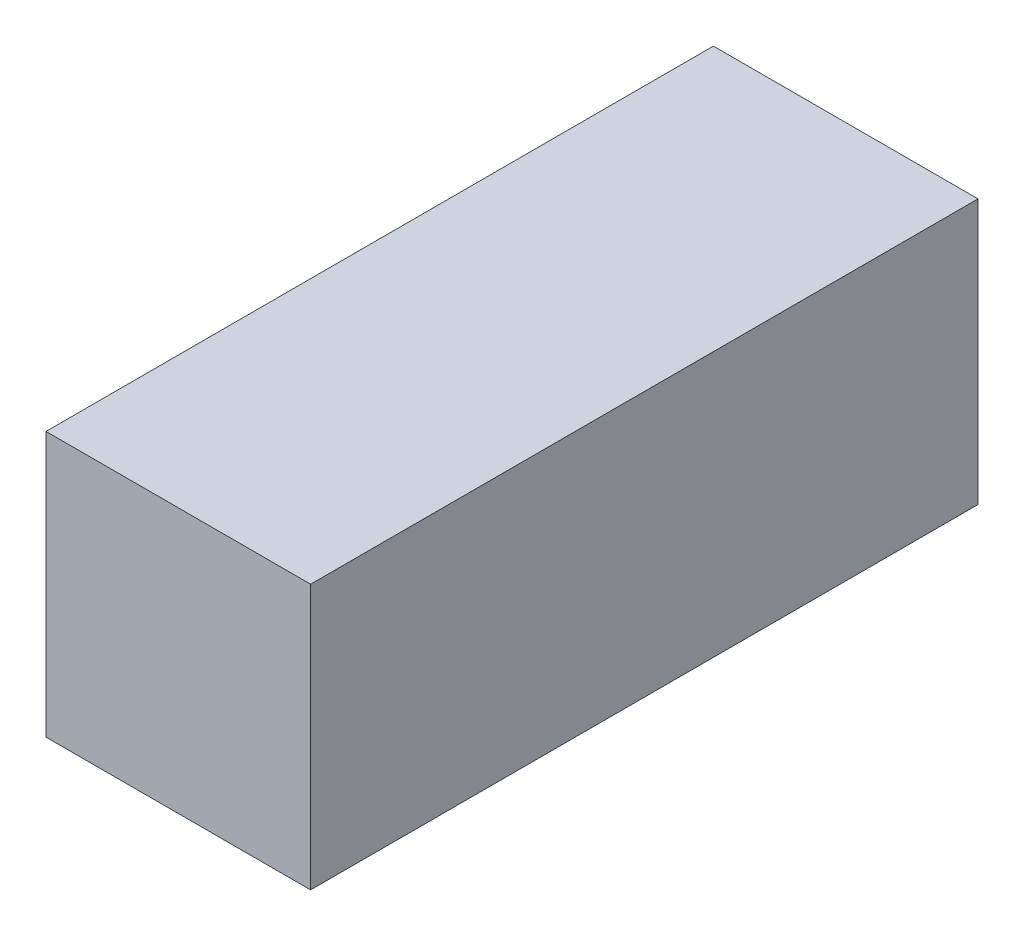
ISO-10303-21;
HEADER;
FILE_DESCRIPTION(('STEP AP214'),'2;1');
FILE_NAME('part.step','',(''),(''),'','','');
FILE_SCHEMA(('AUTOMOTIVE_DESIGN { 1 0 10303 214 1 1 1 1 }'));
ENDSEC;
DATA;
#1=APPLICATION_CONTEXT('core data for automotive mechanical design processes');
#2=APPLICATION_PROTOCOL_DEFINITION('international standard','automotive_design',2000,#1);
#3=PRODUCT_CONTEXT('',#1,'mechanical');
#4=PRODUCT('Part','Part','',(#3));
#5=PRODUCT_RELATED_PRODUCT_CATEGORY('part','',(#4));
#6=PRODUCT_DEFINITION_FORMATION('','',#4);
#7=PRODUCT_DEFINITION_CONTEXT('part definition',#1,'design');
#8=PRODUCT_DEFINITION('design','',#6,#7);
#9=PRODUCT_DEFINITION_SHAPE('','',#8);
#10=(LENGTH_UNIT() NAMED_UNIT(*) SI_UNIT(.MILLI.,.METRE.));
#11=(NAMED_UNIT(*) PLANE_ANGLE_UNIT() SI_UNIT($,.RADIAN.));
#12=(NAMED_UNIT(*) SI_UNIT($,.STERADIAN.) SOLID_ANGLE_UNIT());
#13=UNCERTAINTY_MEASURE_WITH_UNIT(LENGTH_MEASURE(1.E-05),#10,'distance_accuracy_value','');
#14=(GEOMETRIC_REPRESENTATION_CONTEXT(3) GLOBAL_UNCERTAINTY_ASSIGNED_CONTEXT((#13)) GLOBAL_UNIT_ASSIGNED_CONTEXT((#10,
#11,#12)) REPRESENTATION_CONTEXT('',''));
#15=CARTESIAN_POINT('',(0.,0.,0.));
#16=DIRECTION('',(0.,0.,1.));
#17=DIRECTION('',(1.,0.,0.));
#18=AXIS2_PLACEMENT_3D('',#15,#16,#17);
#19=CARTESIAN_POINT('',(-9.243,-1.7825,-21.));
#20=DIRECTION('',(1.,0.,0.));
#21=DIRECTION('',(0.,0.,-1.));
#22=AXIS2_PLACEMENT_3D('',#19,#20,#21);
#23=PLANE('',#22);
#24=DIRECTION('',(0.,-1.,0.));
#25=VECTOR('',#24,1.);
#26=CARTESIAN_POINT('',(-9.243,-1.7825,-22.6));
#27=LINE('',#26,#25);
#28=CARTESIAN_POINT('',(-9.243,-1.7825,-22.6));
#29=VERTEX_POINT('',#28);
#30=CARTESIAN_POINT('',(-9.243,-2.41722769963204,-22.6));
#31=VERTEX_POINT('',#30);
#32=EDGE_CURVE('E11',#29,#31,#27,.T.);
#33=ORIENTED_EDGE('',*,*,#32,.T.);
#34=DIRECTION('',(0.,0.,-1.));
#35=VECTOR('',#34,1.);
#36=CARTESIAN_POINT('',(-9.243,-2.41722769963204,-21.));
#37=LINE('',#36,#35);
#38=CARTESIAN_POINT('',(-9.243,-2.41722769963204,-21.));
#39=VERTEX_POINT('',#38);
#40=EDGE_CURVE('E24',#39,#31,#37,.T.);
#41=ORIENTED_EDGE('',*,*,#40,.F.);
#42=DIRECTION('',(0.,-1.,0.));
#43=VECTOR('',#42,1.);
#44=CARTESIAN_POINT('',(-9.243,-1.7825,-21.));
#45=LINE('',#44,#43);
#46=CARTESIAN_POINT('',(-9.243,-1.7825,-21.));
#47=VERTEX_POINT('',#46);
#48=EDGE_CURVE('E88',#47,#39,#45,.T.);
#49=ORIENTED_EDGE('',*,*,#48,.F.);
#50=DIRECTION('',(0.,0.,-1.));
#51=VECTOR('',#50,1.);
#52=CARTESIAN_POINT('',(-9.243,-1.7825,-21.));
#53=LINE('',#52,#51);
#54=EDGE_CURVE('E77',#47,#29,#53,.T.);
#55=ORIENTED_EDGE('',*,*,#54,.T.);
#56=EDGE_LOOP('',(#33,#41,#49,#55));
#57=FACE_BOUND('',#56,.T.);
#58=ADVANCED_FACE('F17',(#57),#23,.F.);
#59=CARTESIAN_POINT('',(-9.243,-2.41722769963204,-21.));
#60=DIRECTION('',(0.,1.,0.));
#61=DIRECTION('',(0.,0.,1.));
#62=AXIS2_PLACEMENT_3D('',#59,#60,#61);
#63=PLANE('',#62);
#64=DIRECTION('',(1.,0.,0.));
#65=VECTOR('',#64,1.);
#66=CARTESIAN_POINT('',(-9.243,-2.41722769963204,-22.6));
#67=LINE('',#66,#65);
#68=CARTESIAN_POINT('',(-8.60862434545006,-2.41722769963204,-22.6));
#69=VERTEX_POINT('',#68);
#70=EDGE_CURVE('E85',#31,#69,#67,.T.);
#71=ORIENTED_EDGE('',*,*,#70,.T.);
#72=DIRECTION('',(0.,0.,-1.));
#73=VECTOR('',#72,1.);
#74=CARTESIAN_POINT('',(-8.60862434545006,-2.41722769963204,-21.));
#75=LINE('',#74,#73);
#76=CARTESIAN_POINT('',(-8.60862434545006,-2.41722769963204,-21.));
#77=VERTEX_POINT('',#76);
#78=EDGE_CURVE('E83',#77,#69,#75,.T.);
#79=ORIENTED_EDGE('',*,*,#78,.F.);
#80=DIRECTION('',(1.,0.,0.));
#81=VECTOR('',#80,1.);
#82=CARTESIAN_POINT('',(-9.243,-2.41722769963204,-21.));
#83=LINE('',#82,#81);
#84=EDGE_CURVE('E72',#39,#77,#83,.T.);
#85=ORIENTED_EDGE('',*,*,#84,.F.);
#86=ORIENTED_EDGE('',*,*,#40,.T.);
#87=EDGE_LOOP('',(#71,#79,#85,#86));
#88=FACE_BOUND('',#87,.T.);
#89=ADVANCED_FACE('F90',(#88),#63,.F.);
#90=CARTESIAN_POINT('',(-8.60862434545006,-1.7825,-21.));
#91=DIRECTION('',(-1.,0.,0.));
#92=DIRECTION('',(0.,0.,1.));
#93=AXIS2_PLACEMENT_3D('',#90,#91,#92);
#94=PLANE('',#93);
#95=DIRECTION('',(0.,1.,0.));
#96=VECTOR('',#95,1.);
#97=CARTESIAN_POINT('',(-8.60862434545006,-1.7825,-22.6));
#98=LINE('',#97,#96);
#99=CARTESIAN_POINT('',(-8.60862434545006,-1.7825,-22.6));
#100=VERTEX_POINT('',#99);
#101=EDGE_CURVE('E60',#69,#100,#98,.T.);
#102=ORIENTED_EDGE('',*,*,#101,.T.);
#103=DIRECTION('',(0.,0.,-1.));
#104=VECTOR('',#103,1.);
#105=CARTESIAN_POINT('',(-8.60862434545006,-1.7825,-21.));
#106=LINE('',#105,#104);
#107=CARTESIAN_POINT('',(-8.60862434545006,-1.7825,-21.));
#108=VERTEX_POINT('',#107);
#109=EDGE_CURVE('E54',#108,#100,#106,.T.);
#110=ORIENTED_EDGE('',*,*,#109,.F.);
#111=DIRECTION('',(0.,1.,0.));
#112=VECTOR('',#111,1.);
#113=CARTESIAN_POINT('',(-8.60862434545006,-1.7825,-21.));
#114=LINE('',#113,#112);
#115=EDGE_CURVE('E58',#77,#108,#114,.T.);
#116=ORIENTED_EDGE('',*,*,#115,.F.);
#117=ORIENTED_EDGE('',*,*,#78,.T.);
#118=EDGE_LOOP('',(#102,#110,#116,#117));
#119=FACE_BOUND('',#118,.T.);
#120=ADVANCED_FACE('F56',(#119),#94,.F.);
#121=CARTESIAN_POINT('',(-9.243,-1.7825,-21.));
#122=DIRECTION('',(0.,-1.,0.));
#123=DIRECTION('',(0.,0.,-1.));
#124=AXIS2_PLACEMENT_3D('',#121,#122,#123);
#125=PLANE('',#124);
#126=DIRECTION('',(-1.,0.,0.));
#127=VECTOR('',#126,1.);
#128=CARTESIAN_POINT('',(-9.243,-1.7825,-22.6));
#129=LINE('',#128,#127);
#130=EDGE_CURVE('E73',#100,#29,#129,.T.);
#131=ORIENTED_EDGE('',*,*,#130,.T.);
#132=ORIENTED_EDGE('',*,*,#54,.F.);
#133=DIRECTION('',(-1.,0.,0.));
#134=VECTOR('',#133,1.);
#135=CARTESIAN_POINT('',(-9.243,-1.7825,-21.));
#136=LINE('',#135,#134);
#137=EDGE_CURVE('E70',#108,#47,#136,.T.);
#138=ORIENTED_EDGE('',*,*,#137,.F.);
#139=ORIENTED_EDGE('',*,*,#109,.T.);
#140=EDGE_LOOP('',(#131,#132,#138,#139));
#141=FACE_BOUND('',#140,.T.);
#142=ADVANCED_FACE('F76',(#141),#125,.F.);
#143=CARTESIAN_POINT('',(0.,0.,-21.));
#144=DIRECTION('',(0.,0.,1.));
#145=DIRECTION('',(1.,0.,0.));
#146=AXIS2_PLACEMENT_3D('',#143,#144,#145);
#147=PLANE('',#146);
#148=ORIENTED_EDGE('',*,*,#48,.T.);
#149=ORIENTED_EDGE('',*,*,#84,.T.);
#150=ORIENTED_EDGE('',*,*,#115,.T.);
#151=ORIENTED_EDGE('',*,*,#137,.T.);
#152=EDGE_LOOP('',(#148,#149,#150,#151));
#153=FACE_BOUND('',#152,.T.);
#154=ADVANCED_FACE('F69',(#153),#147,.T.);
#155=CARTESIAN_POINT('',(0.,0.,-22.6));
#156=DIRECTION('',(0.,0.,1.));
#157=DIRECTION('',(1.,0.,0.));
#158=AXIS2_PLACEMENT_3D('',#155,#156,#157);
#159=PLANE('',#158);
#160=ORIENTED_EDGE('',*,*,#32,.F.);
#161=ORIENTED_EDGE('',*,*,#130,.F.);
#162=ORIENTED_EDGE('',*,*,#101,.F.);
#163=ORIENTED_EDGE('',*,*,#70,.F.);
#164=EDGE_LOOP('',(#160,#161,#162,#163));
#165=FACE_BOUND('',#164,.T.);
#166=ADVANCED_FACE('F91',(#165),#159,.F.);
#167=CLOSED_SHELL('',(#58,#89,#120,#142,#154,#166));
#168=MANIFOLD_SOLID_BREP('B1',#167);
#169=ADVANCED_BREP_SHAPE_REPRESENTATION('',(#18,#168),#14);
#170=SHAPE_DEFINITION_REPRESENTATION(#9,#169);
ENDSEC;
END-ISO-10303-21;
